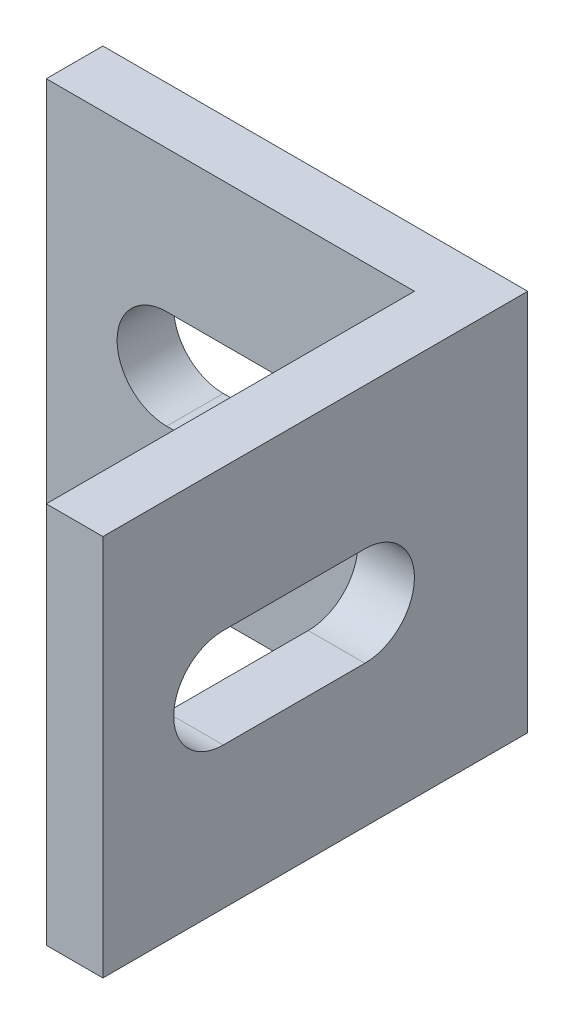
ISO-10303-21;
HEADER;
FILE_DESCRIPTION(('STEP AP214'),'2;1');
FILE_NAME('part.step','',(''),(''),'','','');
FILE_SCHEMA(('AUTOMOTIVE_DESIGN { 1 0 10303 214 1 1 1 1 }'));
ENDSEC;
DATA;
#1=APPLICATION_CONTEXT('core data for automotive mechanical design processes');
#2=APPLICATION_PROTOCOL_DEFINITION('international standard','automotive_design',2000,#1);
#3=PRODUCT_CONTEXT('',#1,'mechanical');
#4=PRODUCT('Part','Part','',(#3));
#5=PRODUCT_RELATED_PRODUCT_CATEGORY('part','',(#4));
#6=PRODUCT_DEFINITION_FORMATION('','',#4);
#7=PRODUCT_DEFINITION_CONTEXT('part definition',#1,'design');
#8=PRODUCT_DEFINITION('design','',#6,#7);
#9=PRODUCT_DEFINITION_SHAPE('','',#8);
#10=(LENGTH_UNIT() NAMED_UNIT(*) SI_UNIT(.MILLI.,.METRE.));
#11=(NAMED_UNIT(*) PLANE_ANGLE_UNIT() SI_UNIT($,.RADIAN.));
#12=(NAMED_UNIT(*) SI_UNIT($,.STERADIAN.) SOLID_ANGLE_UNIT());
#13=UNCERTAINTY_MEASURE_WITH_UNIT(LENGTH_MEASURE(1.E-05),#10,'distance_accuracy_value','');
#14=(GEOMETRIC_REPRESENTATION_CONTEXT(3) GLOBAL_UNCERTAINTY_ASSIGNED_CONTEXT((#13)) GLOBAL_UNIT_ASSIGNED_CONTEXT((#10,
#11,#12)) REPRESENTATION_CONTEXT('',''));
#15=CARTESIAN_POINT('',(0.,0.,0.));
#16=DIRECTION('',(0.,0.,1.));
#17=DIRECTION('',(1.,0.,0.));
#18=AXIS2_PLACEMENT_3D('',#15,#16,#17);
#19=CARTESIAN_POINT('',(0.,0.,4.));
#20=DIRECTION('',(0.,0.,-1.));
#21=DIRECTION('',(-1.,0.,0.));
#22=AXIS2_PLACEMENT_3D('',#19,#20,#21);
#23=PLANE('',#22);
#24=CARTESIAN_POINT('',(8.5,13.5,4.));
#25=DIRECTION('',(0.,0.,1.));
#26=DIRECTION('',(1.,0.,0.));
#27=AXIS2_PLACEMENT_3D('',#24,#25,#26);
#28=CIRCLE('',#27,3.5);
#29=CARTESIAN_POINT('',(8.5,17.,4.));
#30=VERTEX_POINT('',#29);
#31=CARTESIAN_POINT('',(8.5,10.,4.));
#32=VERTEX_POINT('',#31);
#33=EDGE_CURVE('E199',#30,#32,#28,.T.);
#34=ORIENTED_EDGE('',*,*,#33,.F.);
#35=DIRECTION('',(-1.,0.,0.));
#36=VECTOR('',#35,1.);
#37=CARTESIAN_POINT('',(8.5,17.,4.));
#38=LINE('',#37,#36);
#39=CARTESIAN_POINT('',(18.5,17.,4.));
#40=VERTEX_POINT('',#39);
#41=EDGE_CURVE('E207',#40,#30,#38,.T.);
#42=ORIENTED_EDGE('',*,*,#41,.F.);
#43=CARTESIAN_POINT('',(18.5,13.5,4.));
#44=DIRECTION('',(0.,0.,1.));
#45=DIRECTION('',(1.,0.,0.));
#46=AXIS2_PLACEMENT_3D('',#43,#44,#45);
#47=CIRCLE('',#46,3.5);
#48=CARTESIAN_POINT('',(18.5,10.,4.));
#49=VERTEX_POINT('',#48);
#50=EDGE_CURVE('E204',#49,#40,#47,.T.);
#51=ORIENTED_EDGE('',*,*,#50,.F.);
#52=DIRECTION('',(1.,0.,0.));
#53=VECTOR('',#52,1.);
#54=CARTESIAN_POINT('',(8.5,10.,4.));
#55=LINE('',#54,#53);
#56=EDGE_CURVE('E201',#32,#49,#55,.T.);
#57=ORIENTED_EDGE('',*,*,#56,.F.);
#58=EDGE_LOOP('',(#34,#42,#51,#57));
#59=FACE_BOUND('',#58,.T.);
#60=DIRECTION('',(0.,-1.,0.));
#61=VECTOR('',#60,1.);
#62=CARTESIAN_POINT('',(26.,27.,4.));
#63=LINE('',#62,#61);
#64=CARTESIAN_POINT('',(26.,27.,4.));
#65=VERTEX_POINT('',#64);
#66=CARTESIAN_POINT('',(26.,0.,4.));
#67=VERTEX_POINT('',#66);
#68=EDGE_CURVE('E179',#65,#67,#63,.T.);
#69=ORIENTED_EDGE('',*,*,#68,.F.);
#70=DIRECTION('',(-1.,0.,0.));
#71=VECTOR('',#70,1.);
#72=CARTESIAN_POINT('',(0.,27.,4.));
#73=LINE('',#72,#71);
#74=CARTESIAN_POINT('',(0.,27.,4.));
#75=VERTEX_POINT('',#74);
#76=EDGE_CURVE('E236',#65,#75,#73,.T.);
#77=ORIENTED_EDGE('',*,*,#76,.T.);
#78=DIRECTION('',(0.,-1.,0.));
#79=VECTOR('',#78,1.);
#80=CARTESIAN_POINT('',(0.,0.,4.));
#81=LINE('',#80,#79);
#82=CARTESIAN_POINT('',(0.,0.,4.));
#83=VERTEX_POINT('',#82);
#84=EDGE_CURVE('E230',#75,#83,#81,.T.);
#85=ORIENTED_EDGE('',*,*,#84,.T.);
#86=DIRECTION('',(1.,0.,0.));
#87=VECTOR('',#86,1.);
#88=CARTESIAN_POINT('',(0.,0.,4.));
#89=LINE('',#88,#87);
#90=EDGE_CURVE('E233',#83,#67,#89,.T.);
#91=ORIENTED_EDGE('',*,*,#90,.T.);
#92=EDGE_LOOP('',(#69,#77,#85,#91));
#93=FACE_BOUND('',#92,.T.);
#94=ADVANCED_FACE('F41',(#59,#93),#23,.F.);
#95=CARTESIAN_POINT('',(0.,0.,0.));
#96=DIRECTION('',(0.,0.,-1.));
#97=DIRECTION('',(-1.,0.,0.));
#98=AXIS2_PLACEMENT_3D('',#95,#96,#97);
#99=PLANE('',#98);
#100=DIRECTION('',(0.,-1.,0.));
#101=VECTOR('',#100,1.);
#102=CARTESIAN_POINT('',(0.,0.,0.));
#103=LINE('',#102,#101);
#104=CARTESIAN_POINT('',(0.,27.,0.));
#105=VERTEX_POINT('',#104);
#106=CARTESIAN_POINT('',(0.,0.,0.));
#107=VERTEX_POINT('',#106);
#108=EDGE_CURVE('E229',#105,#107,#103,.T.);
#109=ORIENTED_EDGE('',*,*,#108,.F.);
#110=DIRECTION('',(-1.,0.,0.));
#111=VECTOR('',#110,1.);
#112=CARTESIAN_POINT('',(0.,27.,0.));
#113=LINE('',#112,#111);
#114=CARTESIAN_POINT('',(30.,27.,0.));
#115=VERTEX_POINT('',#114);
#116=EDGE_CURVE('E234',#115,#105,#113,.T.);
#117=ORIENTED_EDGE('',*,*,#116,.F.);
#118=DIRECTION('',(0.,1.,0.));
#119=VECTOR('',#118,1.);
#120=CARTESIAN_POINT('',(30.,0.,0.));
#121=LINE('',#120,#119);
#122=CARTESIAN_POINT('',(30.,0.,0.));
#123=VERTEX_POINT('',#122);
#124=EDGE_CURVE('E243',#123,#115,#121,.T.);
#125=ORIENTED_EDGE('',*,*,#124,.F.);
#126=DIRECTION('',(1.,0.,0.));
#127=VECTOR('',#126,1.);
#128=CARTESIAN_POINT('',(0.,0.,0.));
#129=LINE('',#128,#127);
#130=EDGE_CURVE('E241',#107,#123,#129,.T.);
#131=ORIENTED_EDGE('',*,*,#130,.F.);
#132=EDGE_LOOP('',(#109,#117,#125,#131));
#133=FACE_BOUND('',#132,.T.);
#134=DIRECTION('',(-1.,0.,0.));
#135=VECTOR('',#134,1.);
#136=CARTESIAN_POINT('',(8.5,17.,0.));
#137=LINE('',#136,#135);
#138=CARTESIAN_POINT('',(18.5,17.,0.));
#139=VERTEX_POINT('',#138);
#140=CARTESIAN_POINT('',(8.5,17.,0.));
#141=VERTEX_POINT('',#140);
#142=EDGE_CURVE('E202',#139,#141,#137,.T.);
#143=ORIENTED_EDGE('',*,*,#142,.T.);
#144=CARTESIAN_POINT('',(8.5,13.5,0.));
#145=DIRECTION('',(0.,0.,1.));
#146=DIRECTION('',(1.,0.,0.));
#147=AXIS2_PLACEMENT_3D('',#144,#145,#146);
#148=CIRCLE('',#147,3.5);
#149=CARTESIAN_POINT('',(8.5,10.,0.));
#150=VERTEX_POINT('',#149);
#151=EDGE_CURVE('E198',#141,#150,#148,.T.);
#152=ORIENTED_EDGE('',*,*,#151,.T.);
#153=DIRECTION('',(1.,0.,0.));
#154=VECTOR('',#153,1.);
#155=CARTESIAN_POINT('',(8.5,10.,0.));
#156=LINE('',#155,#154);
#157=CARTESIAN_POINT('',(18.5,10.,0.));
#158=VERTEX_POINT('',#157);
#159=EDGE_CURVE('E212',#150,#158,#156,.T.);
#160=ORIENTED_EDGE('',*,*,#159,.T.);
#161=CARTESIAN_POINT('',(18.5,13.5,0.));
#162=DIRECTION('',(0.,0.,1.));
#163=DIRECTION('',(1.,0.,0.));
#164=AXIS2_PLACEMENT_3D('',#161,#162,#163);
#165=CIRCLE('',#164,3.5);
#166=EDGE_CURVE('E215',#158,#139,#165,.T.);
#167=ORIENTED_EDGE('',*,*,#166,.T.);
#168=EDGE_LOOP('',(#143,#152,#160,#167));
#169=FACE_BOUND('',#168,.T.);
#170=ADVANCED_FACE('F260',(#133,#169),#99,.T.);
#171=CARTESIAN_POINT('',(0.,0.,4.));
#172=DIRECTION('',(1.,0.,0.));
#173=DIRECTION('',(0.,0.,-1.));
#174=AXIS2_PLACEMENT_3D('',#171,#172,#173);
#175=PLANE('',#174);
#176=ORIENTED_EDGE('',*,*,#108,.T.);
#177=DIRECTION('',(0.,0.,-1.));
#178=VECTOR('',#177,1.);
#179=CARTESIAN_POINT('',(0.,0.,4.));
#180=LINE('',#179,#178);
#181=EDGE_CURVE('E11',#83,#107,#180,.T.);
#182=ORIENTED_EDGE('',*,*,#181,.F.);
#183=ORIENTED_EDGE('',*,*,#84,.F.);
#184=DIRECTION('',(0.,0.,-1.));
#185=VECTOR('',#184,1.);
#186=CARTESIAN_POINT('',(0.,27.,4.));
#187=LINE('',#186,#185);
#188=EDGE_CURVE('E238',#75,#105,#187,.T.);
#189=ORIENTED_EDGE('',*,*,#188,.T.);
#190=EDGE_LOOP('',(#176,#182,#183,#189));
#191=FACE_BOUND('',#190,.T.);
#192=ADVANCED_FACE('F43',(#191),#175,.F.);
#193=CARTESIAN_POINT('',(0.,0.,4.));
#194=DIRECTION('',(0.,1.,0.));
#195=DIRECTION('',(0.,0.,1.));
#196=AXIS2_PLACEMENT_3D('',#193,#194,#195);
#197=PLANE('',#196);
#198=ORIENTED_EDGE('',*,*,#130,.T.);
#199=DIRECTION('',(0.,0.,-1.));
#200=VECTOR('',#199,1.);
#201=CARTESIAN_POINT('',(30.,0.,4.));
#202=LINE('',#201,#200);
#203=CARTESIAN_POINT('',(30.,0.,30.));
#204=VERTEX_POINT('',#203);
#205=EDGE_CURVE('E49',#204,#123,#202,.T.);
#206=ORIENTED_EDGE('',*,*,#205,.F.);
#207=DIRECTION('',(1.,0.,0.));
#208=VECTOR('',#207,1.);
#209=CARTESIAN_POINT('',(30.,0.,30.));
#210=LINE('',#209,#208);
#211=CARTESIAN_POINT('',(26.,0.,30.));
#212=VERTEX_POINT('',#211);
#213=EDGE_CURVE('E187',#212,#204,#210,.T.);
#214=ORIENTED_EDGE('',*,*,#213,.F.);
#215=DIRECTION('',(0.,0.,-1.));
#216=VECTOR('',#215,1.);
#217=CARTESIAN_POINT('',(26.,0.,30.));
#218=LINE('',#217,#216);
#219=EDGE_CURVE('E190',#212,#67,#218,.T.);
#220=ORIENTED_EDGE('',*,*,#219,.T.);
#221=ORIENTED_EDGE('',*,*,#90,.F.);
#222=ORIENTED_EDGE('',*,*,#181,.T.);
#223=EDGE_LOOP('',(#198,#206,#214,#220,#221,#222));
#224=FACE_BOUND('',#223,.T.);
#225=ADVANCED_FACE('F276',(#224),#197,.F.);
#226=CARTESIAN_POINT('',(30.,0.,4.));
#227=DIRECTION('',(-1.,0.,0.));
#228=DIRECTION('',(0.,0.,1.));
#229=AXIS2_PLACEMENT_3D('',#226,#227,#228);
#230=PLANE('',#229);
#231=DIRECTION('',(0.,0.,1.));
#232=VECTOR('',#231,1.);
#233=CARTESIAN_POINT('',(30.,10.,4.));
#234=LINE('',#233,#232);
#235=CARTESIAN_POINT('',(30.,10.,11.5));
#236=VERTEX_POINT('',#235);
#237=CARTESIAN_POINT('',(30.,10.,21.5));
#238=VERTEX_POINT('',#237);
#239=EDGE_CURVE('E173',#236,#238,#234,.T.);
#240=ORIENTED_EDGE('',*,*,#239,.T.);
#241=CARTESIAN_POINT('',(30.,13.5,21.5));
#242=DIRECTION('',(-1.,0.,0.));
#243=DIRECTION('',(0.,0.,1.));
#244=AXIS2_PLACEMENT_3D('',#241,#242,#243);
#245=CIRCLE('',#244,3.5);
#246=CARTESIAN_POINT('',(30.,17.,21.5));
#247=VERTEX_POINT('',#246);
#248=EDGE_CURVE('E176',#238,#247,#245,.T.);
#249=ORIENTED_EDGE('',*,*,#248,.T.);
#250=DIRECTION('',(0.,0.,-1.));
#251=VECTOR('',#250,1.);
#252=CARTESIAN_POINT('',(30.,17.,4.));
#253=LINE('',#252,#251);
#254=CARTESIAN_POINT('',(30.,17.,11.5));
#255=VERTEX_POINT('',#254);
#256=EDGE_CURVE('E168',#247,#255,#253,.T.);
#257=ORIENTED_EDGE('',*,*,#256,.T.);
#258=CARTESIAN_POINT('',(30.,13.5,11.5));
#259=DIRECTION('',(-1.,0.,0.));
#260=DIRECTION('',(0.,0.,1.));
#261=AXIS2_PLACEMENT_3D('',#258,#259,#260);
#262=CIRCLE('',#261,3.5);
#263=EDGE_CURVE('E148',#255,#236,#262,.T.);
#264=ORIENTED_EDGE('',*,*,#263,.T.);
#265=EDGE_LOOP('',(#240,#249,#257,#264));
#266=FACE_BOUND('',#265,.T.);
#267=ORIENTED_EDGE('',*,*,#124,.T.);
#268=DIRECTION('',(0.,0.,-1.));
#269=VECTOR('',#268,1.);
#270=CARTESIAN_POINT('',(30.,27.,4.));
#271=LINE('',#270,#269);
#272=CARTESIAN_POINT('',(30.,27.,30.));
#273=VERTEX_POINT('',#272);
#274=EDGE_CURVE('E248',#273,#115,#271,.T.);
#275=ORIENTED_EDGE('',*,*,#274,.F.);
#276=DIRECTION('',(0.,1.,0.));
#277=VECTOR('',#276,1.);
#278=CARTESIAN_POINT('',(30.,27.,30.));
#279=LINE('',#278,#277);
#280=EDGE_CURVE('E180',#204,#273,#279,.T.);
#281=ORIENTED_EDGE('',*,*,#280,.F.);
#282=ORIENTED_EDGE('',*,*,#205,.T.);
#283=EDGE_LOOP('',(#267,#275,#281,#282));
#284=FACE_BOUND('',#283,.T.);
#285=ADVANCED_FACE('F254',(#266,#284),#230,.F.);
#286=CARTESIAN_POINT('',(0.,27.,4.));
#287=DIRECTION('',(0.,-1.,0.));
#288=DIRECTION('',(0.,0.,-1.));
#289=AXIS2_PLACEMENT_3D('',#286,#287,#288);
#290=PLANE('',#289);
#291=ORIENTED_EDGE('',*,*,#116,.T.);
#292=ORIENTED_EDGE('',*,*,#188,.F.);
#293=ORIENTED_EDGE('',*,*,#76,.F.);
#294=DIRECTION('',(0.,0.,-1.));
#295=VECTOR('',#294,1.);
#296=CARTESIAN_POINT('',(26.,27.,30.));
#297=LINE('',#296,#295);
#298=CARTESIAN_POINT('',(26.,27.,30.));
#299=VERTEX_POINT('',#298);
#300=EDGE_CURVE('E195',#299,#65,#297,.T.);
#301=ORIENTED_EDGE('',*,*,#300,.F.);
#302=DIRECTION('',(-1.,0.,0.));
#303=VECTOR('',#302,1.);
#304=CARTESIAN_POINT('',(30.,27.,30.));
#305=LINE('',#304,#303);
#306=EDGE_CURVE('E183',#273,#299,#305,.T.);
#307=ORIENTED_EDGE('',*,*,#306,.F.);
#308=ORIENTED_EDGE('',*,*,#274,.T.);
#309=EDGE_LOOP('',(#291,#292,#293,#301,#307,#308));
#310=FACE_BOUND('',#309,.T.);
#311=ADVANCED_FACE('F264',(#310),#290,.F.);
#312=CARTESIAN_POINT('',(8.5,13.5,4.));
#313=DIRECTION('',(0.,0.,-1.));
#314=DIRECTION('',(-1.,0.,0.));
#315=AXIS2_PLACEMENT_3D('',#312,#313,#314);
#316=CYLINDRICAL_SURFACE('',#315,3.5);
#317=ORIENTED_EDGE('',*,*,#151,.F.);
#318=DIRECTION('',(0.,0.,-1.));
#319=VECTOR('',#318,1.);
#320=CARTESIAN_POINT('',(8.5,17.,4.));
#321=LINE('',#320,#319);
#322=EDGE_CURVE('E209',#30,#141,#321,.T.);
#323=ORIENTED_EDGE('',*,*,#322,.F.);
#324=ORIENTED_EDGE('',*,*,#33,.T.);
#325=DIRECTION('',(0.,0.,-1.));
#326=VECTOR('',#325,1.);
#327=CARTESIAN_POINT('',(8.5,10.,4.));
#328=LINE('',#327,#326);
#329=EDGE_CURVE('E226',#32,#150,#328,.T.);
#330=ORIENTED_EDGE('',*,*,#329,.T.);
#331=EDGE_LOOP('',(#317,#323,#324,#330));
#332=FACE_BOUND('',#331,.T.);
#333=ADVANCED_FACE('F295',(#332),#316,.F.);
#334=CARTESIAN_POINT('',(8.5,10.,4.));
#335=DIRECTION('',(0.,1.,0.));
#336=DIRECTION('',(0.,0.,1.));
#337=AXIS2_PLACEMENT_3D('',#334,#335,#336);
#338=PLANE('',#337);
#339=ORIENTED_EDGE('',*,*,#159,.F.);
#340=ORIENTED_EDGE('',*,*,#329,.F.);
#341=ORIENTED_EDGE('',*,*,#56,.T.);
#342=DIRECTION('',(0.,0.,-1.));
#343=VECTOR('',#342,1.);
#344=CARTESIAN_POINT('',(18.5,10.,4.));
#345=LINE('',#344,#343);
#346=EDGE_CURVE('E224',#49,#158,#345,.T.);
#347=ORIENTED_EDGE('',*,*,#346,.T.);
#348=EDGE_LOOP('',(#339,#340,#341,#347));
#349=FACE_BOUND('',#348,.T.);
#350=ADVANCED_FACE('F302',(#349),#338,.T.);
#351=CARTESIAN_POINT('',(18.5,13.5,4.));
#352=DIRECTION('',(0.,0.,-1.));
#353=DIRECTION('',(-1.,0.,0.));
#354=AXIS2_PLACEMENT_3D('',#351,#352,#353);
#355=CYLINDRICAL_SURFACE('',#354,3.5);
#356=ORIENTED_EDGE('',*,*,#166,.F.);
#357=ORIENTED_EDGE('',*,*,#346,.F.);
#358=ORIENTED_EDGE('',*,*,#50,.T.);
#359=DIRECTION('',(0.,0.,-1.));
#360=VECTOR('',#359,1.);
#361=CARTESIAN_POINT('',(18.5,17.,4.));
#362=LINE('',#361,#360);
#363=EDGE_CURVE('E222',#40,#139,#362,.T.);
#364=ORIENTED_EDGE('',*,*,#363,.T.);
#365=EDGE_LOOP('',(#356,#357,#358,#364));
#366=FACE_BOUND('',#365,.T.);
#367=ADVANCED_FACE('F307',(#366),#355,.F.);
#368=CARTESIAN_POINT('',(8.5,17.,4.));
#369=DIRECTION('',(0.,-1.,0.));
#370=DIRECTION('',(0.,0.,-1.));
#371=AXIS2_PLACEMENT_3D('',#368,#369,#370);
#372=PLANE('',#371);
#373=ORIENTED_EDGE('',*,*,#142,.F.);
#374=ORIENTED_EDGE('',*,*,#363,.F.);
#375=ORIENTED_EDGE('',*,*,#41,.T.);
#376=ORIENTED_EDGE('',*,*,#322,.T.);
#377=EDGE_LOOP('',(#373,#374,#375,#376));
#378=FACE_BOUND('',#377,.T.);
#379=ADVANCED_FACE('F313',(#378),#372,.T.);
#380=CARTESIAN_POINT('',(26.,27.,30.));
#381=DIRECTION('',(1.,0.,0.));
#382=DIRECTION('',(0.,1.,0.));
#383=AXIS2_PLACEMENT_3D('',#380,#381,#382);
#384=PLANE('',#383);
#385=DIRECTION('',(0.,0.,-1.));
#386=VECTOR('',#385,1.);
#387=CARTESIAN_POINT('',(26.,17.,21.5));
#388=LINE('',#387,#386);
#389=CARTESIAN_POINT('',(26.,17.,21.5));
#390=VERTEX_POINT('',#389);
#391=CARTESIAN_POINT('',(26.,17.,11.5));
#392=VERTEX_POINT('',#391);
#393=EDGE_CURVE('E154',#390,#392,#388,.T.);
#394=ORIENTED_EDGE('',*,*,#393,.F.);
#395=CARTESIAN_POINT('',(26.,13.5,21.5));
#396=DIRECTION('',(-1.,0.,0.));
#397=DIRECTION('',(0.,0.,1.));
#398=AXIS2_PLACEMENT_3D('',#395,#396,#397);
#399=CIRCLE('',#398,3.5);
#400=CARTESIAN_POINT('',(26.,10.,21.5));
#401=VERTEX_POINT('',#400);
#402=EDGE_CURVE('E64',#401,#390,#399,.T.);
#403=ORIENTED_EDGE('',*,*,#402,.F.);
#404=DIRECTION('',(0.,0.,1.));
#405=VECTOR('',#404,1.);
#406=CARTESIAN_POINT('',(26.,10.,21.5));
#407=LINE('',#406,#405);
#408=CARTESIAN_POINT('',(26.,10.,11.5));
#409=VERTEX_POINT('',#408);
#410=EDGE_CURVE('E161',#409,#401,#407,.T.);
#411=ORIENTED_EDGE('',*,*,#410,.F.);
#412=CARTESIAN_POINT('',(26.,13.5,11.5));
#413=DIRECTION('',(-1.,0.,0.));
#414=DIRECTION('',(0.,0.,1.));
#415=AXIS2_PLACEMENT_3D('',#412,#413,#414);
#416=CIRCLE('',#415,3.5);
#417=EDGE_CURVE('E145',#392,#409,#416,.T.);
#418=ORIENTED_EDGE('',*,*,#417,.F.);
#419=EDGE_LOOP('',(#394,#403,#411,#418));
#420=FACE_BOUND('',#419,.T.);
#421=ORIENTED_EDGE('',*,*,#68,.T.);
#422=ORIENTED_EDGE('',*,*,#219,.F.);
#423=DIRECTION('',(0.,-1.,0.));
#424=VECTOR('',#423,1.);
#425=CARTESIAN_POINT('',(26.,27.,30.));
#426=LINE('',#425,#424);
#427=EDGE_CURVE('E185',#299,#212,#426,.T.);
#428=ORIENTED_EDGE('',*,*,#427,.F.);
#429=ORIENTED_EDGE('',*,*,#300,.T.);
#430=EDGE_LOOP('',(#421,#422,#428,#429));
#431=FACE_BOUND('',#430,.T.);
#432=ADVANCED_FACE('F158',(#420,#431),#384,.F.);
#433=CARTESIAN_POINT('',(0.,0.,30.));
#434=DIRECTION('',(0.,0.,-1.));
#435=DIRECTION('',(-1.,0.,0.));
#436=AXIS2_PLACEMENT_3D('',#433,#434,#435);
#437=PLANE('',#436);
#438=ORIENTED_EDGE('',*,*,#280,.T.);
#439=ORIENTED_EDGE('',*,*,#306,.T.);
#440=ORIENTED_EDGE('',*,*,#427,.T.);
#441=ORIENTED_EDGE('',*,*,#213,.T.);
#442=EDGE_LOOP('',(#438,#439,#440,#441));
#443=FACE_BOUND('',#442,.T.);
#444=ADVANCED_FACE('F275',(#443),#437,.F.);
#445=CARTESIAN_POINT('',(63.,13.5,21.5));
#446=DIRECTION('',(-1.,0.,0.));
#447=DIRECTION('',(0.,0.,1.));
#448=AXIS2_PLACEMENT_3D('',#445,#446,#447);
#449=CYLINDRICAL_SURFACE('',#448,3.5);
#450=DIRECTION('',(-1.,0.,0.));
#451=VECTOR('',#450,1.);
#452=CARTESIAN_POINT('',(63.,10.,21.5));
#453=LINE('',#452,#451);
#454=EDGE_CURVE('E166',#238,#401,#453,.T.);
#455=ORIENTED_EDGE('',*,*,#454,.T.);
#456=ORIENTED_EDGE('',*,*,#402,.T.);
#457=DIRECTION('',(-1.,0.,0.));
#458=VECTOR('',#457,1.);
#459=CARTESIAN_POINT('',(63.,17.,21.5));
#460=LINE('',#459,#458);
#461=EDGE_CURVE('E151',#247,#390,#460,.T.);
#462=ORIENTED_EDGE('',*,*,#461,.F.);
#463=ORIENTED_EDGE('',*,*,#248,.F.);
#464=EDGE_LOOP('',(#455,#456,#462,#463));
#465=FACE_BOUND('',#464,.T.);
#466=ADVANCED_FACE('F329',(#465),#449,.F.);
#467=CARTESIAN_POINT('',(63.,10.,21.5));
#468=DIRECTION('',(0.,-1.,0.));
#469=DIRECTION('',(0.,0.,-1.));
#470=AXIS2_PLACEMENT_3D('',#467,#468,#469);
#471=PLANE('',#470);
#472=DIRECTION('',(-1.,0.,0.));
#473=VECTOR('',#472,1.);
#474=CARTESIAN_POINT('',(63.,10.,11.5));
#475=LINE('',#474,#473);
#476=EDGE_CURVE('E150',#236,#409,#475,.T.);
#477=ORIENTED_EDGE('',*,*,#476,.T.);
#478=ORIENTED_EDGE('',*,*,#410,.T.);
#479=ORIENTED_EDGE('',*,*,#454,.F.);
#480=ORIENTED_EDGE('',*,*,#239,.F.);
#481=EDGE_LOOP('',(#477,#478,#479,#480));
#482=FACE_BOUND('',#481,.T.);
#483=ADVANCED_FACE('F332',(#482),#471,.F.);
#484=CARTESIAN_POINT('',(63.,13.5,11.5));
#485=DIRECTION('',(-1.,0.,0.));
#486=DIRECTION('',(0.,0.,1.));
#487=AXIS2_PLACEMENT_3D('',#484,#485,#486);
#488=CYLINDRICAL_SURFACE('',#487,3.5);
#489=DIRECTION('',(-1.,0.,0.));
#490=VECTOR('',#489,1.);
#491=CARTESIAN_POINT('',(63.,17.,11.5));
#492=LINE('',#491,#490);
#493=EDGE_CURVE('E56',#255,#392,#492,.T.);
#494=ORIENTED_EDGE('',*,*,#493,.T.);
#495=ORIENTED_EDGE('',*,*,#417,.T.);
#496=ORIENTED_EDGE('',*,*,#476,.F.);
#497=ORIENTED_EDGE('',*,*,#263,.F.);
#498=EDGE_LOOP('',(#494,#495,#496,#497));
#499=FACE_BOUND('',#498,.T.);
#500=ADVANCED_FACE('F142',(#499),#488,.F.);
#501=CARTESIAN_POINT('',(63.,17.,21.5));
#502=DIRECTION('',(0.,1.,0.));
#503=DIRECTION('',(0.,0.,1.));
#504=AXIS2_PLACEMENT_3D('',#501,#502,#503);
#505=PLANE('',#504);
#506=ORIENTED_EDGE('',*,*,#461,.T.);
#507=ORIENTED_EDGE('',*,*,#393,.T.);
#508=ORIENTED_EDGE('',*,*,#493,.F.);
#509=ORIENTED_EDGE('',*,*,#256,.F.);
#510=EDGE_LOOP('',(#506,#507,#508,#509));
#511=FACE_BOUND('',#510,.T.);
#512=ADVANCED_FACE('F155',(#511),#505,.F.);
#513=CLOSED_SHELL('',(#94,#170,#192,#225,#285,#311,#333,#350,#367,#379,#432,#444,#466,#483,#500,#512));
#514=MANIFOLD_SOLID_BREP('B2',#513);
#515=ADVANCED_BREP_SHAPE_REPRESENTATION('',(#18,#514),#14);
#516=SHAPE_DEFINITION_REPRESENTATION(#9,#515);
ENDSEC;
END-ISO-10303-21;
